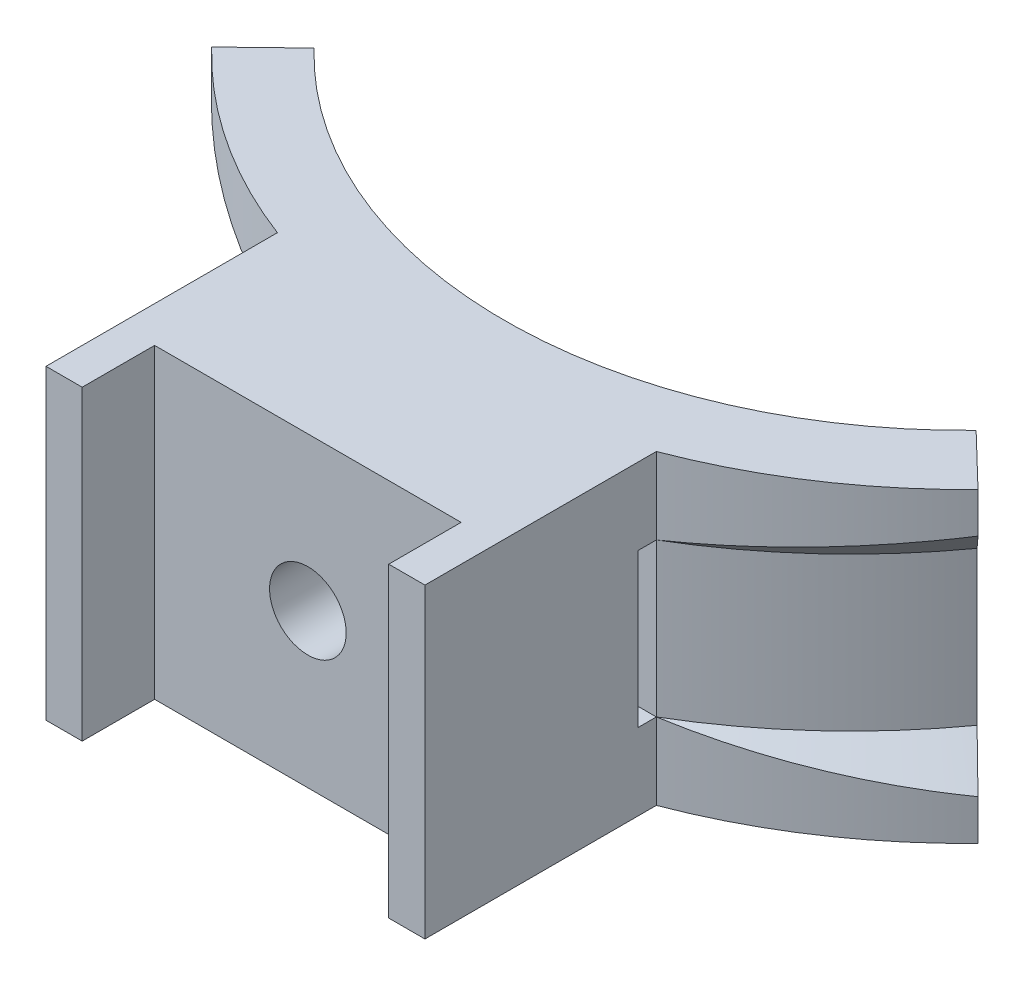
ISO-10303-21;
HEADER;
FILE_DESCRIPTION(('STEP AP214'),'2;1');
FILE_NAME('part.step','',(''),(''),'','','');
FILE_SCHEMA(('AUTOMOTIVE_DESIGN { 1 0 10303 214 1 1 1 1 }'));
ENDSEC;
DATA;
#1=APPLICATION_CONTEXT('core data for automotive mechanical design processes');
#2=APPLICATION_PROTOCOL_DEFINITION('international standard','automotive_design',2000,#1);
#3=PRODUCT_CONTEXT('',#1,'mechanical');
#4=PRODUCT('Part','Part','',(#3));
#5=PRODUCT_RELATED_PRODUCT_CATEGORY('part','',(#4));
#6=PRODUCT_DEFINITION_FORMATION('','',#4);
#7=PRODUCT_DEFINITION_CONTEXT('part definition',#1,'design');
#8=PRODUCT_DEFINITION('design','',#6,#7);
#9=PRODUCT_DEFINITION_SHAPE('','',#8);
#10=(LENGTH_UNIT() NAMED_UNIT(*) SI_UNIT(.MILLI.,.METRE.));
#11=(NAMED_UNIT(*) PLANE_ANGLE_UNIT() SI_UNIT($,.RADIAN.));
#12=(NAMED_UNIT(*) SI_UNIT($,.STERADIAN.) SOLID_ANGLE_UNIT());
#13=UNCERTAINTY_MEASURE_WITH_UNIT(LENGTH_MEASURE(1.E-05),#10,'distance_accuracy_value','');
#14=(GEOMETRIC_REPRESENTATION_CONTEXT(3) GLOBAL_UNCERTAINTY_ASSIGNED_CONTEXT((#13)) GLOBAL_UNIT_ASSIGNED_CONTEXT((#10,
#11,#12)) REPRESENTATION_CONTEXT('',''));
#15=CARTESIAN_POINT('',(0.,0.,0.));
#16=DIRECTION('',(0.,0.,1.));
#17=DIRECTION('',(1.,0.,0.));
#18=AXIS2_PLACEMENT_3D('',#15,#16,#17);
#19=CARTESIAN_POINT('',(0.,25.4,0.));
#20=DIRECTION('',(0.,-1.,0.));
#21=DIRECTION('',(0.,0.,-1.));
#22=AXIS2_PLACEMENT_3D('',#19,#20,#21);
#23=CYLINDRICAL_SURFACE('',#22,44.1);
#24=CARTESIAN_POINT('',(-15.7,19.05,41.2106782278574));
#25=CARTESIAN_POINT('',(-16.1794318143844,19.1377452047471,41.0280290347982));
#26=CARTESIAN_POINT('',(-16.6557143404373,19.2250043785236,40.8369988944627));
#27=CARTESIAN_POINT('',(-17.6014853007342,19.398478543785,40.4383619029228));
#28=CARTESIAN_POINT('',(-18.0709737171541,19.4846935325305,40.230755008239));
#29=CARTESIAN_POINT('',(-19.46836332792,19.741638080068,39.5834121464063));
#30=CARTESIAN_POINT('',(-20.3853306341585,19.9106931522492,39.1191000000862));
#31=CARTESIAN_POINT('',(-22.1852458721086,20.2436078493372,38.1271686212862));
#32=CARTESIAN_POINT('',(-23.0681937123725,20.4074674602779,37.5995492186456));
#33=CARTESIAN_POINT('',(-24.7958080114586,20.7293807747171,36.483359329689));
#34=CARTESIAN_POINT('',(-25.6404743588203,20.8874344613108,35.8947886659234));
#35=CARTESIAN_POINT('',(-27.2873534500066,21.1971476330918,34.6593397989529));
#36=CARTESIAN_POINT('',(-28.0895660628164,21.3488070985459,34.0124614158234));
#37=CARTESIAN_POINT('',(-29.3685424485167,21.5921031279074,32.9049620087819));
#38=CARTESIAN_POINT('',(-29.859031796271,21.6857963947918,32.4605343667437));
#39=CARTESIAN_POINT('',(-30.8198732270883,21.8701830885772,31.5497029800591));
#40=CARTESIAN_POINT('',(-31.2902227045263,21.9608761269762,31.0832964081549));
#41=CARTESIAN_POINT('',(-31.75,22.0499999999999,30.6063310444098));
#42=B_SPLINE_CURVE_WITH_KNOTS('',3,(#24,#25,#26,#27,#28,#29,#30,#31,#32,#33,#34,#35,#36,#37,#38,
#39,#40,#41),.UNSPECIFIED.,.F.,.F.,(4,2,2,2,2,2,2,2,4),(0.,1.56132329162508,3.12265067860206,
6.24484478020459,9.36704727399547,12.4892588578211,15.6114800764251,17.6163183400962,
19.6214152037198),.UNSPECIFIED.);
#43=CARTESIAN_POINT('',(-15.7,19.05,41.2106782278574));
#44=VERTEX_POINT('',#43);
#45=CARTESIAN_POINT('',(-31.75,22.0499999999999,30.6063310444098));
#46=VERTEX_POINT('',#45);
#47=EDGE_CURVE('E203',#44,#46,#42,.T.);
#48=ORIENTED_EDGE('',*,*,#47,.F.);
#49=DIRECTION('',(0.,-1.,0.));
#50=VECTOR('',#49,1.);
#51=CARTESIAN_POINT('',(-15.7,25.4,41.2106782278574));
#52=LINE('',#51,#50);
#53=CARTESIAN_POINT('',(-15.7,25.4,41.2106782278574));
#54=VERTEX_POINT('',#53);
#55=EDGE_CURVE('E268',#54,#44,#52,.T.);
#56=ORIENTED_EDGE('',*,*,#55,.F.);
#57=CARTESIAN_POINT('',(0.,25.4,0.));
#58=DIRECTION('',(0.,1.,0.));
#59=DIRECTION('',(0.,0.,1.));
#60=AXIS2_PLACEMENT_3D('',#57,#58,#59);
#61=CIRCLE('',#60,44.1);
#62=CARTESIAN_POINT('',(-31.75,25.4,30.6063310444097));
#63=VERTEX_POINT('',#62);
#64=EDGE_CURVE('E227',#63,#54,#61,.T.);
#65=ORIENTED_EDGE('',*,*,#64,.F.);
#66=DIRECTION('',(0.,-1.,0.));
#67=VECTOR('',#66,1.);
#68=CARTESIAN_POINT('',(-31.75,25.4,30.6063310444097));
#69=LINE('',#68,#67);
#70=EDGE_CURVE('E220',#63,#46,#69,.T.);
#71=ORIENTED_EDGE('',*,*,#70,.T.);
#72=EDGE_LOOP('',(#48,#56,#65,#71));
#73=FACE_BOUND('',#72,.T.);
#74=ADVANCED_FACE('F32',(#73),#23,.T.);
#75=CARTESIAN_POINT('',(-27.4302721088435,25.4,26.4422043717009));
#76=DIRECTION('',(0.694021112118135,0.,0.719954648526077));
#77=DIRECTION('',(0.719954648526077,0.,-0.694021112118135));
#78=AXIS2_PLACEMENT_3D('',#75,#76,#77);
#79=PLANE('',#78);
#80=DIRECTION('',(-0.509084814119573,0.707106781186538,0.49074703466537));
#81=VECTOR('',#80,1.);
#82=CARTESIAN_POINT('',(-29.5901360544218,19.05,28.5242677080554));
#83=LINE('',#82,#81);
#84=CARTESIAN_POINT('',(-29.5901360544218,19.05,28.5242677080553));
#85=VERTEX_POINT('',#84);
#86=EDGE_CURVE('E206',#85,#46,#83,.T.);
#87=ORIENTED_EDGE('',*,*,#86,.T.);
#88=ORIENTED_EDGE('',*,*,#70,.F.);
#89=DIRECTION('',(-0.719954648526077,0.,0.694021112118135));
#90=VECTOR('',#89,1.);
#91=CARTESIAN_POINT('',(-27.4302721088435,25.4,26.4422043717009));
#92=LINE('',#91,#90);
#93=CARTESIAN_POINT('',(-27.4302721088435,25.4,26.4422043717009));
#94=VERTEX_POINT('',#93);
#95=EDGE_CURVE('E234',#94,#63,#92,.T.);
#96=ORIENTED_EDGE('',*,*,#95,.F.);
#97=DIRECTION('',(0.,-1.,0.));
#98=VECTOR('',#97,1.);
#99=CARTESIAN_POINT('',(-27.4302721088435,25.4,26.4422043717009));
#100=LINE('',#99,#98);
#101=CARTESIAN_POINT('',(-27.4302721088435,0.,26.4422043717009));
#102=VERTEX_POINT('',#101);
#103=EDGE_CURVE('E228',#94,#102,#100,.T.);
#104=ORIENTED_EDGE('',*,*,#103,.T.);
#105=DIRECTION('',(-0.719954648526077,0.,0.694021112118135));
#106=VECTOR('',#105,1.);
#107=CARTESIAN_POINT('',(-27.4302721088435,0.,26.4422043717009));
#108=LINE('',#107,#106);
#109=CARTESIAN_POINT('',(-31.75,0.,30.6063310444097));
#110=VERTEX_POINT('',#109);
#111=EDGE_CURVE('E236',#102,#110,#108,.T.);
#112=ORIENTED_EDGE('',*,*,#111,.T.);
#113=CARTESIAN_POINT('',(-31.75,3.35000000000008,30.6063310444098));
#114=VERTEX_POINT('',#113);
#115=EDGE_CURVE('E229',#114,#110,#69,.T.);
#116=ORIENTED_EDGE('',*,*,#115,.F.);
#117=DIRECTION('',(-0.509084814119573,-0.707106781186538,0.49074703466537));
#118=VECTOR('',#117,1.);
#119=CARTESIAN_POINT('',(-29.5901360544218,6.35,28.5242677080554));
#120=LINE('',#119,#118);
#121=CARTESIAN_POINT('',(-29.5901360544218,6.35,28.5242677080554));
#122=VERTEX_POINT('',#121);
#123=EDGE_CURVE('E213',#122,#114,#120,.T.);
#124=ORIENTED_EDGE('',*,*,#123,.F.);
#125=DIRECTION('',(0.,-1.,0.));
#126=VECTOR('',#125,1.);
#127=CARTESIAN_POINT('',(-29.5901360544218,39.5084337591357,28.5242677080553));
#128=LINE('',#127,#126);
#129=EDGE_CURVE('E224',#85,#122,#128,.T.);
#130=ORIENTED_EDGE('',*,*,#129,.F.);
#131=EDGE_LOOP('',(#87,#88,#96,#104,#112,#116,#124,#130));
#132=FACE_BOUND('',#131,.T.);
#133=ADVANCED_FACE('F218',(#132),#79,.F.);
#134=CARTESIAN_POINT('',(0.,25.4,0.));
#135=DIRECTION('',(0.,-1.,0.));
#136=DIRECTION('',(0.,0.,-1.));
#137=AXIS2_PLACEMENT_3D('',#134,#135,#136);
#138=CYLINDRICAL_SURFACE('',#137,44.1);
#139=CARTESIAN_POINT('',(15.7,6.34999999999997,41.2106782278574));
#140=CARTESIAN_POINT('',(16.1794318143844,6.2622547952529,41.0280290347982));
#141=CARTESIAN_POINT('',(16.6557143404373,6.17499562147643,40.8369988944627));
#142=CARTESIAN_POINT('',(17.6014853007342,6.00152145621501,40.4383619029227));
#143=CARTESIAN_POINT('',(18.0709737171541,5.91530646746954,40.230755008239));
#144=CARTESIAN_POINT('',(19.46836332792,5.65836191993195,39.5834121464062));
#145=CARTESIAN_POINT('',(20.3853306341585,5.4893068477508,39.1191000000862));
#146=CARTESIAN_POINT('',(22.1852458721086,5.15639215066279,38.1271686212862));
#147=CARTESIAN_POINT('',(23.0681937123725,4.99253253972206,37.5995492186456));
#148=CARTESIAN_POINT('',(24.7958080114586,4.67061922528286,36.483359329689));
#149=CARTESIAN_POINT('',(25.6404743588203,4.51256553868918,35.8947886659235));
#150=CARTESIAN_POINT('',(27.2873534500066,4.20285236690818,34.6593397989529));
#151=CARTESIAN_POINT('',(28.0895660628164,4.05119290145411,34.0124614158234));
#152=CARTESIAN_POINT('',(29.3685424485167,3.80789687209262,32.9049620087819));
#153=CARTESIAN_POINT('',(29.859031796271,3.71420360520819,32.4605343667437));
#154=CARTESIAN_POINT('',(30.8198732270883,3.52981691142275,31.5497029800591));
#155=CARTESIAN_POINT('',(31.2902227045263,3.43912387302378,31.0832964081549));
#156=CARTESIAN_POINT('',(31.75,3.35000000000008,30.6063310444098));
#157=B_SPLINE_CURVE_WITH_KNOTS('',3,(#139,#140,#141,#142,#143,#144,#145,#146,#147,#148,#149,
#150,#151,#152,#153,#154,#155,#156),.UNSPECIFIED.,.F.,.F.,(4,2,2,2,2,2,2,2,4),(0.,
1.56132329162508,3.12265067860206,6.24484478020458,9.36704727399547,12.4892588578211,
15.6114800764251,17.6163183400962,19.6214152037198),.UNSPECIFIED.);
#158=CARTESIAN_POINT('',(15.7,6.34999999999996,41.2106782278574));
#159=VERTEX_POINT('',#158);
#160=CARTESIAN_POINT('',(31.75,3.35000000000008,30.6063310444098));
#161=VERTEX_POINT('',#160);
#162=EDGE_CURVE('E450',#159,#161,#157,.T.);
#163=ORIENTED_EDGE('',*,*,#162,.F.);
#164=DIRECTION('',(0.,-1.,0.));
#165=VECTOR('',#164,1.);
#166=CARTESIAN_POINT('',(15.7,25.4,41.2106782278574));
#167=LINE('',#166,#165);
#168=CARTESIAN_POINT('',(15.7,0.,41.2106782278574));
#169=VERTEX_POINT('',#168);
#170=EDGE_CURVE('E245',#159,#169,#167,.T.);
#171=ORIENTED_EDGE('',*,*,#170,.T.);
#172=CARTESIAN_POINT('',(0.,0.,0.));
#173=DIRECTION('',(0.,1.,0.));
#174=DIRECTION('',(0.,0.,1.));
#175=AXIS2_PLACEMENT_3D('',#172,#173,#174);
#176=CIRCLE('',#175,44.1);
#177=CARTESIAN_POINT('',(31.75,0.,30.6063310444097));
#178=VERTEX_POINT('',#177);
#179=EDGE_CURVE('E425',#169,#178,#176,.T.);
#180=ORIENTED_EDGE('',*,*,#179,.T.);
#181=DIRECTION('',(0.,-1.,0.));
#182=VECTOR('',#181,1.);
#183=CARTESIAN_POINT('',(31.75,25.4,30.6063310444097));
#184=LINE('',#183,#182);
#185=EDGE_CURVE('E241',#161,#178,#184,.T.);
#186=ORIENTED_EDGE('',*,*,#185,.F.);
#187=EDGE_LOOP('',(#163,#171,#180,#186));
#188=FACE_BOUND('',#187,.T.);
#189=ADVANCED_FACE('F489',(#188),#138,.T.);
#190=CARTESIAN_POINT('',(27.4302721088435,25.4,26.4422043717009));
#191=DIRECTION('',(-0.694021112118135,0.,0.719954648526077));
#192=DIRECTION('',(0.719954648526077,0.,0.694021112118135));
#193=AXIS2_PLACEMENT_3D('',#190,#191,#192);
#194=PLANE('',#193);
#195=DIRECTION('',(0.509084814119573,-0.707106781186538,0.49074703466537));
#196=VECTOR('',#195,1.);
#197=CARTESIAN_POINT('',(29.5901360544218,6.35,28.5242677080554));
#198=LINE('',#197,#196);
#199=CARTESIAN_POINT('',(29.5901360544218,6.34999999999995,28.5242677080553));
#200=VERTEX_POINT('',#199);
#201=EDGE_CURVE('E447',#200,#161,#198,.T.);
#202=ORIENTED_EDGE('',*,*,#201,.T.);
#203=ORIENTED_EDGE('',*,*,#185,.T.);
#204=DIRECTION('',(-0.719954648526077,0.,-0.694021112118135));
#205=VECTOR('',#204,1.);
#206=CARTESIAN_POINT('',(27.4302721088435,0.,26.4422043717009));
#207=LINE('',#206,#205);
#208=CARTESIAN_POINT('',(27.4302721088435,0.,26.4422043717009));
#209=VERTEX_POINT('',#208);
#210=EDGE_CURVE('E428',#178,#209,#207,.T.);
#211=ORIENTED_EDGE('',*,*,#210,.T.);
#212=DIRECTION('',(0.,-1.,0.));
#213=VECTOR('',#212,1.);
#214=CARTESIAN_POINT('',(27.4302721088435,25.4,26.4422043717009));
#215=LINE('',#214,#213);
#216=CARTESIAN_POINT('',(27.4302721088435,25.4,26.4422043717009));
#217=VERTEX_POINT('',#216);
#218=EDGE_CURVE('E232',#217,#209,#215,.T.);
#219=ORIENTED_EDGE('',*,*,#218,.F.);
#220=DIRECTION('',(-0.719954648526077,0.,-0.694021112118135));
#221=VECTOR('',#220,1.);
#222=CARTESIAN_POINT('',(27.4302721088435,25.4,26.4422043717009));
#223=LINE('',#222,#221);
#224=CARTESIAN_POINT('',(31.75,25.4,30.6063310444097));
#225=VERTEX_POINT('',#224);
#226=EDGE_CURVE('E403',#225,#217,#223,.T.);
#227=ORIENTED_EDGE('',*,*,#226,.F.);
#228=CARTESIAN_POINT('',(31.75,22.0499999999999,30.6063310444098));
#229=VERTEX_POINT('',#228);
#230=EDGE_CURVE('E242',#225,#229,#184,.T.);
#231=ORIENTED_EDGE('',*,*,#230,.T.);
#232=DIRECTION('',(0.509084814119573,0.707106781186538,0.49074703466537));
#233=VECTOR('',#232,1.);
#234=CARTESIAN_POINT('',(29.5901360544218,19.05,28.5242677080554));
#235=LINE('',#234,#233);
#236=CARTESIAN_POINT('',(29.5901360544218,19.05,28.5242677080554));
#237=VERTEX_POINT('',#236);
#238=EDGE_CURVE('E480',#237,#229,#235,.T.);
#239=ORIENTED_EDGE('',*,*,#238,.F.);
#240=DIRECTION('',(0.,-1.,0.));
#241=VECTOR('',#240,1.);
#242=CARTESIAN_POINT('',(29.5901360544218,39.5084337591357,28.5242677080553));
#243=LINE('',#242,#241);
#244=EDGE_CURVE('E343',#237,#200,#243,.T.);
#245=ORIENTED_EDGE('',*,*,#244,.T.);
#246=EDGE_LOOP('',(#202,#203,#211,#219,#227,#231,#239,#245));
#247=FACE_BOUND('',#246,.T.);
#248=ADVANCED_FACE('F490',(#247),#194,.F.);
#249=CARTESIAN_POINT('',(-15.7,6.35,41.2106782278574));
#250=VERTEX_POINT('',#249);
#251=CARTESIAN_POINT('',(-15.7,0.,41.2106782278574));
#252=VERTEX_POINT('',#251);
#253=EDGE_CURVE('E267',#250,#252,#52,.T.);
#254=ORIENTED_EDGE('',*,*,#253,.F.);
#255=CARTESIAN_POINT('',(-15.7,6.34999999999995,41.2106782278574));
#256=CARTESIAN_POINT('',(-16.1794318143844,6.26225479525288,41.0280290347982));
#257=CARTESIAN_POINT('',(-16.6557143404373,6.17499562147642,40.8369988944627));
#258=CARTESIAN_POINT('',(-17.6014853007342,6.001521456215,40.4383619029228));
#259=CARTESIAN_POINT('',(-18.070973717154,5.91530646746954,40.230755008239));
#260=CARTESIAN_POINT('',(-19.46836332792,5.65836191993195,39.5834121464063));
#261=CARTESIAN_POINT('',(-20.3853306341585,5.4893068477508,39.1191000000862));
#262=CARTESIAN_POINT('',(-22.1852458721086,5.15639215066278,38.1271686212862));
#263=CARTESIAN_POINT('',(-23.0681937123725,4.99253253972206,37.5995492186456));
#264=CARTESIAN_POINT('',(-24.7958080114586,4.67061922528285,36.483359329689));
#265=CARTESIAN_POINT('',(-25.6404743588203,4.51256553868917,35.8947886659235));
#266=CARTESIAN_POINT('',(-27.2873534500066,4.20285236690818,34.6593397989529));
#267=CARTESIAN_POINT('',(-28.0895660628164,4.05119290145411,34.0124614158233));
#268=CARTESIAN_POINT('',(-29.3685424485167,3.80789687209262,32.9049620087819));
#269=CARTESIAN_POINT('',(-29.859031796271,3.71420360520818,32.4605343667437));
#270=CARTESIAN_POINT('',(-30.8198732270883,3.52981691142274,31.5497029800591));
#271=CARTESIAN_POINT('',(-31.2902227045263,3.43912387302377,31.0832964081549));
#272=CARTESIAN_POINT('',(-31.75,3.35000000000008,30.6063310444098));
#273=B_SPLINE_CURVE_WITH_KNOTS('',3,(#255,#256,#257,#258,#259,#260,#261,#262,#263,#264,#265,
#266,#267,#268,#269,#270,#271,#272),.UNSPECIFIED.,.F.,.F.,(4,2,2,2,2,2,2,2,4),(0.,
1.56132329162508,3.12265067860205,6.24484478020458,9.36704727399548,12.4892588578211,
15.6114800764251,17.6163183400962,19.6214152037198),.UNSPECIFIED.);
#274=EDGE_CURVE('E445',#250,#114,#273,.T.);
#275=ORIENTED_EDGE('',*,*,#274,.T.);
#276=ORIENTED_EDGE('',*,*,#115,.T.);
#277=CARTESIAN_POINT('',(0.,0.,0.));
#278=DIRECTION('',(0.,1.,0.));
#279=DIRECTION('',(0.,0.,1.));
#280=AXIS2_PLACEMENT_3D('',#277,#278,#279);
#281=CIRCLE('',#280,44.1);
#282=EDGE_CURVE('E385',#110,#252,#281,.T.);
#283=ORIENTED_EDGE('',*,*,#282,.T.);
#284=EDGE_LOOP('',(#254,#275,#276,#283));
#285=FACE_BOUND('',#284,.T.);
#286=ADVANCED_FACE('F443',(#285),#23,.T.);
#287=CARTESIAN_POINT('',(-15.7,25.4,41.2106782278574));
#288=DIRECTION('',(1.,0.,0.));
#289=DIRECTION('',(0.,0.,-1.));
#290=AXIS2_PLACEMENT_3D('',#287,#288,#289);
#291=PLANE('',#290);
#292=ORIENTED_EDGE('',*,*,#55,.T.);
#293=DIRECTION('',(0.,0.,1.));
#294=VECTOR('',#293,1.);
#295=CARTESIAN_POINT('',(-15.7,19.05,41.2106782278574));
#296=LINE('',#295,#294);
#297=CARTESIAN_POINT('',(-15.7,19.05,42.7106782278574));
#298=VERTEX_POINT('',#297);
#299=EDGE_CURVE('E376',#44,#298,#296,.T.);
#300=ORIENTED_EDGE('',*,*,#299,.T.);
#301=DIRECTION('',(0.,-1.,0.));
#302=VECTOR('',#301,1.);
#303=CARTESIAN_POINT('',(-15.7,25.4,42.7106782278574));
#304=LINE('',#303,#302);
#305=CARTESIAN_POINT('',(-15.7,6.35,42.7106782278574));
#306=VERTEX_POINT('',#305);
#307=EDGE_CURVE('E379',#298,#306,#304,.T.);
#308=ORIENTED_EDGE('',*,*,#307,.T.);
#309=DIRECTION('',(0.,0.,-1.));
#310=VECTOR('',#309,1.);
#311=CARTESIAN_POINT('',(-15.7,6.35,41.2106782278574));
#312=LINE('',#311,#310);
#313=EDGE_CURVE('E382',#306,#250,#312,.T.);
#314=ORIENTED_EDGE('',*,*,#313,.T.);
#315=ORIENTED_EDGE('',*,*,#253,.T.);
#316=DIRECTION('',(0.,0.,1.));
#317=VECTOR('',#316,1.);
#318=CARTESIAN_POINT('',(-15.7,0.,41.2106782278574));
#319=LINE('',#318,#317);
#320=CARTESIAN_POINT('',(-15.7,0.,60.385));
#321=VERTEX_POINT('',#320);
#322=EDGE_CURVE('E410',#252,#321,#319,.T.);
#323=ORIENTED_EDGE('',*,*,#322,.T.);
#324=DIRECTION('',(0.,-1.,0.));
#325=VECTOR('',#324,1.);
#326=CARTESIAN_POINT('',(-15.7,25.4,60.385));
#327=LINE('',#326,#325);
#328=CARTESIAN_POINT('',(-15.7,25.4,60.385));
#329=VERTEX_POINT('',#328);
#330=EDGE_CURVE('E264',#329,#321,#327,.T.);
#331=ORIENTED_EDGE('',*,*,#330,.F.);
#332=DIRECTION('',(0.,0.,1.));
#333=VECTOR('',#332,1.);
#334=CARTESIAN_POINT('',(-15.7,25.4,41.2106782278574));
#335=LINE('',#334,#333);
#336=EDGE_CURVE('E387',#54,#329,#335,.T.);
#337=ORIENTED_EDGE('',*,*,#336,.F.);
#338=EDGE_LOOP('',(#292,#300,#308,#314,#315,#323,#331,#337));
#339=FACE_BOUND('',#338,.T.);
#340=ADVANCED_FACE('F514',(#339),#291,.F.);
#341=CARTESIAN_POINT('',(-15.7,25.4,60.385));
#342=DIRECTION('',(0.,0.,-1.));
#343=DIRECTION('',(-1.,0.,0.));
#344=AXIS2_PLACEMENT_3D('',#341,#342,#343);
#345=PLANE('',#344);
#346=DIRECTION('',(1.,0.,0.));
#347=VECTOR('',#346,1.);
#348=CARTESIAN_POINT('',(-15.7,0.,60.385));
#349=LINE('',#348,#347);
#350=CARTESIAN_POINT('',(-12.7,0.,60.385));
#351=VERTEX_POINT('',#350);
#352=EDGE_CURVE('E412',#321,#351,#349,.T.);
#353=ORIENTED_EDGE('',*,*,#352,.T.);
#354=DIRECTION('',(0.,-1.,0.));
#355=VECTOR('',#354,1.);
#356=CARTESIAN_POINT('',(-12.7,25.4,60.385));
#357=LINE('',#356,#355);
#358=CARTESIAN_POINT('',(-12.7,25.4,60.385));
#359=VERTEX_POINT('',#358);
#360=EDGE_CURVE('E261',#359,#351,#357,.T.);
#361=ORIENTED_EDGE('',*,*,#360,.F.);
#362=DIRECTION('',(1.,0.,0.));
#363=VECTOR('',#362,1.);
#364=CARTESIAN_POINT('',(-15.7,25.4,60.385));
#365=LINE('',#364,#363);
#366=EDGE_CURVE('E389',#329,#359,#365,.T.);
#367=ORIENTED_EDGE('',*,*,#366,.F.);
#368=ORIENTED_EDGE('',*,*,#330,.T.);
#369=EDGE_LOOP('',(#353,#361,#367,#368));
#370=FACE_BOUND('',#369,.T.);
#371=ADVANCED_FACE('F511',(#370),#345,.F.);
#372=CARTESIAN_POINT('',(-12.7,25.4,54.385));
#373=DIRECTION('',(-1.,0.,0.));
#374=DIRECTION('',(0.,0.,1.));
#375=AXIS2_PLACEMENT_3D('',#372,#373,#374);
#376=PLANE('',#375);
#377=DIRECTION('',(0.,0.,-1.));
#378=VECTOR('',#377,1.);
#379=CARTESIAN_POINT('',(-12.7,0.,54.385));
#380=LINE('',#379,#378);
#381=CARTESIAN_POINT('',(-12.7,0.,54.385));
#382=VERTEX_POINT('',#381);
#383=EDGE_CURVE('E414',#351,#382,#380,.T.);
#384=ORIENTED_EDGE('',*,*,#383,.T.);
#385=DIRECTION('',(0.,-1.,0.));
#386=VECTOR('',#385,1.);
#387=CARTESIAN_POINT('',(-12.7,25.4,54.385));
#388=LINE('',#387,#386);
#389=CARTESIAN_POINT('',(-12.7,25.4,54.385));
#390=VERTEX_POINT('',#389);
#391=EDGE_CURVE('E258',#390,#382,#388,.T.);
#392=ORIENTED_EDGE('',*,*,#391,.F.);
#393=DIRECTION('',(0.,0.,-1.));
#394=VECTOR('',#393,1.);
#395=CARTESIAN_POINT('',(-12.7,25.4,54.385));
#396=LINE('',#395,#394);
#397=EDGE_CURVE('E391',#359,#390,#396,.T.);
#398=ORIENTED_EDGE('',*,*,#397,.F.);
#399=ORIENTED_EDGE('',*,*,#360,.T.);
#400=EDGE_LOOP('',(#384,#392,#398,#399));
#401=FACE_BOUND('',#400,.T.);
#402=ADVANCED_FACE('F507',(#401),#376,.F.);
#403=CARTESIAN_POINT('',(-12.7,25.4,54.385));
#404=DIRECTION('',(0.,0.,-1.));
#405=DIRECTION('',(-1.,0.,0.));
#406=AXIS2_PLACEMENT_3D('',#403,#404,#405);
#407=PLANE('',#406);
#408=CARTESIAN_POINT('',(0.,12.7,54.385));
#409=DIRECTION('',(0.,0.,1.));
#410=DIRECTION('',(1.,0.,0.));
#411=AXIS2_PLACEMENT_3D('',#408,#409,#410);
#412=CIRCLE('',#411,3.175);
#413=CARTESIAN_POINT('',(3.175,12.7,54.385));
#414=VERTEX_POINT('',#413);
#415=EDGE_CURVE('E333',#414,#414,#412,.T.);
#416=ORIENTED_EDGE('',*,*,#415,.F.);
#417=EDGE_LOOP('',(#416));
#418=FACE_BOUND('',#417,.T.);
#419=DIRECTION('',(1.,0.,0.));
#420=VECTOR('',#419,1.);
#421=CARTESIAN_POINT('',(-12.7,0.,54.385));
#422=LINE('',#421,#420);
#423=CARTESIAN_POINT('',(12.7,0.,54.385));
#424=VERTEX_POINT('',#423);
#425=EDGE_CURVE('E416',#382,#424,#422,.T.);
#426=ORIENTED_EDGE('',*,*,#425,.T.);
#427=DIRECTION('',(0.,-1.,0.));
#428=VECTOR('',#427,1.);
#429=CARTESIAN_POINT('',(12.7,25.4,54.385));
#430=LINE('',#429,#428);
#431=CARTESIAN_POINT('',(12.7,25.4,54.385));
#432=VERTEX_POINT('',#431);
#433=EDGE_CURVE('E255',#432,#424,#430,.T.);
#434=ORIENTED_EDGE('',*,*,#433,.F.);
#435=DIRECTION('',(1.,0.,0.));
#436=VECTOR('',#435,1.);
#437=CARTESIAN_POINT('',(-12.7,25.4,54.385));
#438=LINE('',#437,#436);
#439=EDGE_CURVE('E393',#390,#432,#438,.T.);
#440=ORIENTED_EDGE('',*,*,#439,.F.);
#441=ORIENTED_EDGE('',*,*,#391,.T.);
#442=EDGE_LOOP('',(#426,#434,#440,#441));
#443=FACE_BOUND('',#442,.T.);
#444=ADVANCED_FACE('F503',(#418,#443),#407,.F.);
#445=CARTESIAN_POINT('',(12.7,25.4,54.385));
#446=DIRECTION('',(1.,0.,0.));
#447=DIRECTION('',(0.,0.,-1.));
#448=AXIS2_PLACEMENT_3D('',#445,#446,#447);
#449=PLANE('',#448);
#450=DIRECTION('',(0.,0.,1.));
#451=VECTOR('',#450,1.);
#452=CARTESIAN_POINT('',(12.7,0.,54.385));
#453=LINE('',#452,#451);
#454=CARTESIAN_POINT('',(12.7,0.,60.385));
#455=VERTEX_POINT('',#454);
#456=EDGE_CURVE('E418',#424,#455,#453,.T.);
#457=ORIENTED_EDGE('',*,*,#456,.T.);
#458=DIRECTION('',(0.,-1.,0.));
#459=VECTOR('',#458,1.);
#460=CARTESIAN_POINT('',(12.7,25.4,60.385));
#461=LINE('',#460,#459);
#462=CARTESIAN_POINT('',(12.7,25.4,60.385));
#463=VERTEX_POINT('',#462);
#464=EDGE_CURVE('E252',#463,#455,#461,.T.);
#465=ORIENTED_EDGE('',*,*,#464,.F.);
#466=DIRECTION('',(0.,0.,1.));
#467=VECTOR('',#466,1.);
#468=CARTESIAN_POINT('',(12.7,25.4,54.385));
#469=LINE('',#468,#467);
#470=EDGE_CURVE('E395',#432,#463,#469,.T.);
#471=ORIENTED_EDGE('',*,*,#470,.F.);
#472=ORIENTED_EDGE('',*,*,#433,.T.);
#473=EDGE_LOOP('',(#457,#465,#471,#472));
#474=FACE_BOUND('',#473,.T.);
#475=ADVANCED_FACE('F499',(#474),#449,.F.);
#476=CARTESIAN_POINT('',(15.7,25.4,60.385));
#477=DIRECTION('',(0.,0.,-1.));
#478=DIRECTION('',(-1.,0.,0.));
#479=AXIS2_PLACEMENT_3D('',#476,#477,#478);
#480=PLANE('',#479);
#481=DIRECTION('',(1.,0.,0.));
#482=VECTOR('',#481,1.);
#483=CARTESIAN_POINT('',(15.7,0.,60.385));
#484=LINE('',#483,#482);
#485=CARTESIAN_POINT('',(15.7,0.,60.385));
#486=VERTEX_POINT('',#485);
#487=EDGE_CURVE('E420',#455,#486,#484,.T.);
#488=ORIENTED_EDGE('',*,*,#487,.T.);
#489=DIRECTION('',(0.,-1.,0.));
#490=VECTOR('',#489,1.);
#491=CARTESIAN_POINT('',(15.7,25.4,60.385));
#492=LINE('',#491,#490);
#493=CARTESIAN_POINT('',(15.7,25.4,60.385));
#494=VERTEX_POINT('',#493);
#495=EDGE_CURVE('E249',#494,#486,#492,.T.);
#496=ORIENTED_EDGE('',*,*,#495,.F.);
#497=DIRECTION('',(1.,0.,0.));
#498=VECTOR('',#497,1.);
#499=CARTESIAN_POINT('',(15.7,25.4,60.385));
#500=LINE('',#499,#498);
#501=EDGE_CURVE('E397',#463,#494,#500,.T.);
#502=ORIENTED_EDGE('',*,*,#501,.F.);
#503=ORIENTED_EDGE('',*,*,#464,.T.);
#504=EDGE_LOOP('',(#488,#496,#502,#503));
#505=FACE_BOUND('',#504,.T.);
#506=ADVANCED_FACE('F495',(#505),#480,.F.);
#507=CARTESIAN_POINT('',(15.7,25.4,41.2106782278574));
#508=DIRECTION('',(-1.,0.,0.));
#509=DIRECTION('',(0.,0.,1.));
#510=AXIS2_PLACEMENT_3D('',#507,#508,#509);
#511=PLANE('',#510);
#512=ORIENTED_EDGE('',*,*,#170,.F.);
#513=DIRECTION('',(0.,0.,-1.));
#514=VECTOR('',#513,1.);
#515=CARTESIAN_POINT('',(15.7,6.35,41.2106782278574));
#516=LINE('',#515,#514);
#517=CARTESIAN_POINT('',(15.7,6.35,42.7106782278574));
#518=VERTEX_POINT('',#517);
#519=EDGE_CURVE('E361',#518,#159,#516,.T.);
#520=ORIENTED_EDGE('',*,*,#519,.F.);
#521=DIRECTION('',(0.,-1.,0.));
#522=VECTOR('',#521,1.);
#523=CARTESIAN_POINT('',(15.7,19.05,42.7106782278574));
#524=LINE('',#523,#522);
#525=CARTESIAN_POINT('',(15.7,19.05,42.7106782278574));
#526=VERTEX_POINT('',#525);
#527=EDGE_CURVE('E358',#526,#518,#524,.T.);
#528=ORIENTED_EDGE('',*,*,#527,.F.);
#529=DIRECTION('',(0.,0.,1.));
#530=VECTOR('',#529,1.);
#531=CARTESIAN_POINT('',(15.7,19.05,41.2106782278574));
#532=LINE('',#531,#530);
#533=CARTESIAN_POINT('',(15.7,19.05,41.2106782278574));
#534=VERTEX_POINT('',#533);
#535=EDGE_CURVE('E355',#534,#526,#532,.T.);
#536=ORIENTED_EDGE('',*,*,#535,.F.);
#537=CARTESIAN_POINT('',(15.7,25.4,41.2106782278574));
#538=VERTEX_POINT('',#537);
#539=EDGE_CURVE('E246',#538,#534,#167,.T.);
#540=ORIENTED_EDGE('',*,*,#539,.F.);
#541=DIRECTION('',(0.,0.,-1.));
#542=VECTOR('',#541,1.);
#543=CARTESIAN_POINT('',(15.7,25.4,41.2106782278574));
#544=LINE('',#543,#542);
#545=EDGE_CURVE('E399',#494,#538,#544,.T.);
#546=ORIENTED_EDGE('',*,*,#545,.F.);
#547=ORIENTED_EDGE('',*,*,#495,.T.);
#548=DIRECTION('',(0.,0.,-1.));
#549=VECTOR('',#548,1.);
#550=CARTESIAN_POINT('',(15.7,0.,41.2106782278574));
#551=LINE('',#550,#549);
#552=EDGE_CURVE('E422',#486,#169,#551,.T.);
#553=ORIENTED_EDGE('',*,*,#552,.T.);
#554=EDGE_LOOP('',(#512,#520,#528,#536,#540,#546,#547,#553));
#555=FACE_BOUND('',#554,.T.);
#556=ADVANCED_FACE('F487',(#555),#511,.F.);
#557=ORIENTED_EDGE('',*,*,#539,.T.);
#558=CARTESIAN_POINT('',(15.7,19.05,41.2106782278574));
#559=CARTESIAN_POINT('',(16.1794318143844,19.1377452047471,41.0280290347982));
#560=CARTESIAN_POINT('',(16.6557143404373,19.2250043785236,40.8369988944627));
#561=CARTESIAN_POINT('',(17.6014853007342,19.398478543785,40.4383619029228));
#562=CARTESIAN_POINT('',(18.070973717154,19.4846935325305,40.230755008239));
#563=CARTESIAN_POINT('',(19.46836332792,19.741638080068,39.5834121464062));
#564=CARTESIAN_POINT('',(20.3853306341585,19.9106931522492,39.1191000000862));
#565=CARTESIAN_POINT('',(22.1852458721086,20.2436078493372,38.1271686212862));
#566=CARTESIAN_POINT('',(23.0681937123725,20.4074674602779,37.5995492186456));
#567=CARTESIAN_POINT('',(24.7958080114586,20.7293807747171,36.483359329689));
#568=CARTESIAN_POINT('',(25.6404743588203,20.8874344613108,35.8947886659235));
#569=CARTESIAN_POINT('',(27.2873534500066,21.1971476330918,34.659339798953));
#570=CARTESIAN_POINT('',(28.0895660628164,21.3488070985459,34.0124614158234));
#571=CARTESIAN_POINT('',(29.3685424485167,21.5921031279074,32.9049620087819));
#572=CARTESIAN_POINT('',(29.859031796271,21.6857963947918,32.4605343667437));
#573=CARTESIAN_POINT('',(30.8198732270883,21.8701830885773,31.5497029800591));
#574=CARTESIAN_POINT('',(31.2902227045263,21.9608761269762,31.0832964081549));
#575=CARTESIAN_POINT('',(31.75,22.0499999999999,30.6063310444098));
#576=B_SPLINE_CURVE_WITH_KNOTS('',3,(#558,#559,#560,#561,#562,#563,#564,#565,#566,#567,#568,
#569,#570,#571,#572,#573,#574,#575),.UNSPECIFIED.,.F.,.F.,(4,2,2,2,2,2,2,2,4),(0.,
1.56132329162509,3.12265067860206,6.24484478020459,9.36704727399547,12.4892588578211,
15.6114800764251,17.6163183400962,19.6214152037198),.UNSPECIFIED.);
#577=EDGE_CURVE('E307',#534,#229,#576,.T.);
#578=ORIENTED_EDGE('',*,*,#577,.T.);
#579=ORIENTED_EDGE('',*,*,#230,.F.);
#580=CARTESIAN_POINT('',(0.,25.4,0.));
#581=DIRECTION('',(0.,1.,0.));
#582=DIRECTION('',(0.,0.,1.));
#583=AXIS2_PLACEMENT_3D('',#580,#581,#582);
#584=CIRCLE('',#583,44.1);
#585=EDGE_CURVE('E401',#538,#225,#584,.T.);
#586=ORIENTED_EDGE('',*,*,#585,.F.);
#587=EDGE_LOOP('',(#557,#578,#579,#586));
#588=FACE_BOUND('',#587,.T.);
#589=ADVANCED_FACE('F481',(#588),#138,.T.);
#590=CARTESIAN_POINT('',(0.,25.4,0.));
#591=DIRECTION('',(0.,-1.,0.));
#592=DIRECTION('',(0.,0.,-1.));
#593=AXIS2_PLACEMENT_3D('',#590,#591,#592);
#594=CYLINDRICAL_SURFACE('',#593,38.1);
#595=CARTESIAN_POINT('',(0.,7.14375,0.));
#596=DIRECTION('',(0.,-1.,0.));
#597=DIRECTION('',(0.,0.,-1.));
#598=AXIS2_PLACEMENT_3D('',#595,#596,#597);
#599=CIRCLE('',#598,38.1);
#600=CARTESIAN_POINT('',(-3.20790243318486,7.14375,37.9647120623766));
#601=VERTEX_POINT('',#600);
#602=CARTESIAN_POINT('',(3.20790243318485,7.14375,37.9647120623766));
#603=VERTEX_POINT('',#602);
#604=EDGE_CURVE('E330',#601,#603,#599,.F.);
#605=ORIENTED_EDGE('',*,*,#604,.T.);
#606=CARTESIAN_POINT('',(0.,1.58750000000001,0.));
#607=DIRECTION('',(0.866025403784439,-0.5,0.));
#608=DIRECTION('',(-0.5,-0.866025403784439,0.));
#609=AXIS2_PLACEMENT_3D('',#606,#607,#608);
#610=ELLIPSE('',#609,76.2,38.1);
#611=CARTESIAN_POINT('',(6.41580486636971,12.7,37.5559242718997));
#612=VERTEX_POINT('',#611);
#613=EDGE_CURVE('E298',#603,#612,#610,.F.);
#614=ORIENTED_EDGE('',*,*,#613,.T.);
#615=CARTESIAN_POINT('',(0.,23.8125,0.));
#616=DIRECTION('',(0.866025403784439,0.5,0.));
#617=DIRECTION('',(0.5,-0.866025403784439,0.));
#618=AXIS2_PLACEMENT_3D('',#615,#616,#617);
#619=ELLIPSE('',#618,76.2,38.1);
#620=CARTESIAN_POINT('',(3.20790243318486,18.25625,37.9647120623766));
#621=VERTEX_POINT('',#620);
#622=EDGE_CURVE('E299',#612,#621,#619,.F.);
#623=ORIENTED_EDGE('',*,*,#622,.T.);
#624=CARTESIAN_POINT('',(0.,18.25625,0.));
#625=DIRECTION('',(0.,1.,0.));
#626=DIRECTION('',(0.,0.,1.));
#627=AXIS2_PLACEMENT_3D('',#624,#625,#626);
#628=CIRCLE('',#627,38.1);
#629=CARTESIAN_POINT('',(-3.20790243318486,18.25625,37.9647120623766));
#630=VERTEX_POINT('',#629);
#631=EDGE_CURVE('E302',#621,#630,#628,.F.);
#632=ORIENTED_EDGE('',*,*,#631,.T.);
#633=CARTESIAN_POINT('',(0.,23.8125,0.));
#634=DIRECTION('',(-0.866025403784439,0.5,0.));
#635=DIRECTION('',(-0.5,-0.866025403784439,0.));
#636=AXIS2_PLACEMENT_3D('',#633,#634,#635);
#637=ELLIPSE('',#636,76.2,38.1);
#638=CARTESIAN_POINT('',(-6.41580486636972,12.7,37.5559242718997));
#639=VERTEX_POINT('',#638);
#640=EDGE_CURVE('E324',#630,#639,#637,.F.);
#641=ORIENTED_EDGE('',*,*,#640,.T.);
#642=CARTESIAN_POINT('',(0.,1.58749999999999,0.));
#643=DIRECTION('',(-0.866025403784439,-0.5,0.));
#644=DIRECTION('',(0.5,-0.866025403784439,0.));
#645=AXIS2_PLACEMENT_3D('',#642,#643,#644);
#646=ELLIPSE('',#645,76.2,38.1);
#647=EDGE_CURVE('E327',#639,#601,#646,.F.);
#648=ORIENTED_EDGE('',*,*,#647,.T.);
#649=EDGE_LOOP('',(#605,#614,#623,#632,#641,#648));
#650=FACE_BOUND('',#649,.T.);
#651=CARTESIAN_POINT('',(0.,0.,0.));
#652=DIRECTION('',(0.,-1.,0.));
#653=DIRECTION('',(0.,0.,1.));
#654=AXIS2_PLACEMENT_3D('',#651,#652,#653);
#655=CIRCLE('',#654,38.1);
#656=EDGE_CURVE('E429',#209,#102,#655,.T.);
#657=ORIENTED_EDGE('',*,*,#656,.T.);
#658=ORIENTED_EDGE('',*,*,#103,.F.);
#659=CARTESIAN_POINT('',(0.,25.4,0.));
#660=DIRECTION('',(0.,-1.,0.));
#661=DIRECTION('',(0.,0.,1.));
#662=AXIS2_PLACEMENT_3D('',#659,#660,#661);
#663=CIRCLE('',#662,38.1);
#664=EDGE_CURVE('E405',#217,#94,#663,.T.);
#665=ORIENTED_EDGE('',*,*,#664,.F.);
#666=ORIENTED_EDGE('',*,*,#218,.T.);
#667=EDGE_LOOP('',(#657,#658,#665,#666));
#668=FACE_BOUND('',#667,.T.);
#669=ADVANCED_FACE('F486',(#650,#668),#594,.F.);
#670=CARTESIAN_POINT('',(0.,25.4,0.));
#671=DIRECTION('',(0.,1.,0.));
#672=DIRECTION('',(0.,0.,1.));
#673=AXIS2_PLACEMENT_3D('',#670,#671,#672);
#674=PLANE('',#673);
#675=ORIENTED_EDGE('',*,*,#64,.T.);
#676=ORIENTED_EDGE('',*,*,#336,.T.);
#677=ORIENTED_EDGE('',*,*,#366,.T.);
#678=ORIENTED_EDGE('',*,*,#397,.T.);
#679=ORIENTED_EDGE('',*,*,#439,.T.);
#680=ORIENTED_EDGE('',*,*,#470,.T.);
#681=ORIENTED_EDGE('',*,*,#501,.T.);
#682=ORIENTED_EDGE('',*,*,#545,.T.);
#683=ORIENTED_EDGE('',*,*,#585,.T.);
#684=ORIENTED_EDGE('',*,*,#226,.T.);
#685=ORIENTED_EDGE('',*,*,#664,.T.);
#686=ORIENTED_EDGE('',*,*,#95,.T.);
#687=EDGE_LOOP('',(#675,#676,#677,#678,#679,#680,#681,#682,#683,#684,#685,#686));
#688=FACE_BOUND('',#687,.T.);
#689=ADVANCED_FACE('F533',(#688),#674,.T.);
#690=CARTESIAN_POINT('',(0.,0.,0.));
#691=DIRECTION('',(0.,1.,0.));
#692=DIRECTION('',(0.,0.,1.));
#693=AXIS2_PLACEMENT_3D('',#690,#691,#692);
#694=PLANE('',#693);
#695=ORIENTED_EDGE('',*,*,#282,.F.);
#696=ORIENTED_EDGE('',*,*,#111,.F.);
#697=ORIENTED_EDGE('',*,*,#656,.F.);
#698=ORIENTED_EDGE('',*,*,#210,.F.);
#699=ORIENTED_EDGE('',*,*,#179,.F.);
#700=ORIENTED_EDGE('',*,*,#552,.F.);
#701=ORIENTED_EDGE('',*,*,#487,.F.);
#702=ORIENTED_EDGE('',*,*,#456,.F.);
#703=ORIENTED_EDGE('',*,*,#425,.F.);
#704=ORIENTED_EDGE('',*,*,#383,.F.);
#705=ORIENTED_EDGE('',*,*,#352,.F.);
#706=ORIENTED_EDGE('',*,*,#322,.F.);
#707=EDGE_LOOP('',(#695,#696,#697,#698,#699,#700,#701,#702,#703,#704,#705,#706));
#708=FACE_BOUND('',#707,.T.);
#709=ADVANCED_FACE('F439',(#708),#694,.F.);
#710=CARTESIAN_POINT('',(-31.75,6.35,41.2106782278574));
#711=DIRECTION('',(0.,-1.,0.));
#712=DIRECTION('',(0.,0.,-1.));
#713=AXIS2_PLACEMENT_3D('',#710,#711,#712);
#714=PLANE('',#713);
#715=DIRECTION('',(1.,0.,0.));
#716=VECTOR('',#715,1.);
#717=CARTESIAN_POINT('',(-31.75,6.35,42.7106782278574));
#718=LINE('',#717,#716);
#719=EDGE_CURVE('E369',#306,#518,#718,.T.);
#720=ORIENTED_EDGE('',*,*,#719,.T.);
#721=ORIENTED_EDGE('',*,*,#519,.T.);
#722=DIRECTION('',(1.,0.,0.));
#723=VECTOR('',#722,1.);
#724=CARTESIAN_POINT('',(-31.75,6.35,41.2106782278574));
#725=LINE('',#724,#723);
#726=EDGE_CURVE('E365',#250,#159,#725,.T.);
#727=ORIENTED_EDGE('',*,*,#726,.F.);
#728=ORIENTED_EDGE('',*,*,#313,.F.);
#729=EDGE_LOOP('',(#720,#721,#727,#728));
#730=FACE_BOUND('',#729,.T.);
#731=ADVANCED_FACE('F572',(#730),#714,.F.);
#732=CARTESIAN_POINT('',(-31.75,19.05,42.7106782278574));
#733=DIRECTION('',(0.,0.,1.));
#734=DIRECTION('',(1.,0.,0.));
#735=AXIS2_PLACEMENT_3D('',#732,#733,#734);
#736=PLANE('',#735);
#737=CARTESIAN_POINT('',(0.,12.7,42.7106782278574));
#738=DIRECTION('',(0.,0.,1.));
#739=DIRECTION('',(1.,0.,0.));
#740=AXIS2_PLACEMENT_3D('',#737,#738,#739);
#741=CIRCLE('',#740,3.175);
#742=CARTESIAN_POINT('',(3.175,12.7,42.7106782278574));
#743=VERTEX_POINT('',#742);
#744=EDGE_CURVE('E336',#743,#743,#741,.T.);
#745=ORIENTED_EDGE('',*,*,#744,.T.);
#746=EDGE_LOOP('',(#745));
#747=FACE_BOUND('',#746,.T.);
#748=DIRECTION('',(1.,0.,0.));
#749=VECTOR('',#748,1.);
#750=CARTESIAN_POINT('',(-31.75,19.05,42.7106782278574));
#751=LINE('',#750,#749);
#752=EDGE_CURVE('E371',#298,#526,#751,.T.);
#753=ORIENTED_EDGE('',*,*,#752,.T.);
#754=ORIENTED_EDGE('',*,*,#527,.T.);
#755=ORIENTED_EDGE('',*,*,#719,.F.);
#756=ORIENTED_EDGE('',*,*,#307,.F.);
#757=EDGE_LOOP('',(#753,#754,#755,#756));
#758=FACE_BOUND('',#757,.T.);
#759=ADVANCED_FACE('F575',(#747,#758),#736,.F.);
#760=CARTESIAN_POINT('',(-31.75,19.05,41.2106782278574));
#761=DIRECTION('',(0.,1.,0.));
#762=DIRECTION('',(0.,0.,1.));
#763=AXIS2_PLACEMENT_3D('',#760,#761,#762);
#764=PLANE('',#763);
#765=DIRECTION('',(1.,0.,0.));
#766=VECTOR('',#765,1.);
#767=CARTESIAN_POINT('',(-31.75,19.05,41.2106782278574));
#768=LINE('',#767,#766);
#769=EDGE_CURVE('E364',#44,#534,#768,.T.);
#770=ORIENTED_EDGE('',*,*,#769,.T.);
#771=ORIENTED_EDGE('',*,*,#535,.T.);
#772=ORIENTED_EDGE('',*,*,#752,.F.);
#773=ORIENTED_EDGE('',*,*,#299,.F.);
#774=EDGE_LOOP('',(#770,#771,#772,#773));
#775=FACE_BOUND('',#774,.T.);
#776=ADVANCED_FACE('F579',(#775),#764,.F.);
#777=CARTESIAN_POINT('',(-31.75,19.05,41.2106782278574));
#778=DIRECTION('',(0.,0.,-1.));
#779=DIRECTION('',(0.,1.,0.));
#780=AXIS2_PLACEMENT_3D('',#777,#778,#779);
#781=PLANE('',#780);
#782=DIRECTION('',(0.5,-0.866025403784439,0.));
#783=VECTOR('',#782,1.);
#784=CARTESIAN_POINT('',(-5.87527700723829,33.988778285078,41.2106782278574));
#785=LINE('',#784,#783);
#786=CARTESIAN_POINT('',(3.20790243318486,18.25625,41.2106782278574));
#787=VERTEX_POINT('',#786);
#788=CARTESIAN_POINT('',(6.41580486636972,12.7,41.2106782278574));
#789=VERTEX_POINT('',#788);
#790=EDGE_CURVE('E271',#787,#789,#785,.T.);
#791=ORIENTED_EDGE('',*,*,#790,.T.);
#792=DIRECTION('',(-0.5,-0.866025403784439,0.));
#793=VECTOR('',#792,1.);
#794=CARTESIAN_POINT('',(-0.376015693207124,0.936221714922032,41.2106782278574));
#795=LINE('',#794,#793);
#796=CARTESIAN_POINT('',(3.20790243318485,7.14375,41.2106782278574));
#797=VERTEX_POINT('',#796);
#798=EDGE_CURVE('E11',#789,#797,#795,.T.);
#799=ORIENTED_EDGE('',*,*,#798,.T.);
#800=DIRECTION('',(-1.,0.,0.));
#801=VECTOR('',#800,1.);
#802=CARTESIAN_POINT('',(-31.75,7.14375,41.2106782278574));
#803=LINE('',#802,#801);
#804=CARTESIAN_POINT('',(-3.20790243318486,7.14375,41.2106782278574));
#805=VERTEX_POINT('',#804);
#806=EDGE_CURVE('E40',#797,#805,#803,.T.);
#807=ORIENTED_EDGE('',*,*,#806,.T.);
#808=DIRECTION('',(-0.5,0.866025403784439,0.));
#809=VECTOR('',#808,1.);
#810=CARTESIAN_POINT('',(-15.4989843067929,28.432528285078,41.2106782278574));
#811=LINE('',#810,#809);
#812=CARTESIAN_POINT('',(-6.41580486636972,12.7,41.2106782278574));
#813=VERTEX_POINT('',#812);
#814=EDGE_CURVE('E280',#805,#813,#811,.T.);
#815=ORIENTED_EDGE('',*,*,#814,.T.);
#816=DIRECTION('',(0.5,0.866025403784439,0.));
#817=VECTOR('',#816,1.);
#818=CARTESIAN_POINT('',(-9.9997229927617,6.49247171492203,41.2106782278574));
#819=LINE('',#818,#817);
#820=CARTESIAN_POINT('',(-3.20790243318486,18.25625,41.2106782278574));
#821=VERTEX_POINT('',#820);
#822=EDGE_CURVE('E277',#813,#821,#819,.T.);
#823=ORIENTED_EDGE('',*,*,#822,.T.);
#824=DIRECTION('',(1.,0.,0.));
#825=VECTOR('',#824,1.);
#826=CARTESIAN_POINT('',(-31.75,18.25625,41.2106782278574));
#827=LINE('',#826,#825);
#828=EDGE_CURVE('E274',#821,#787,#827,.T.);
#829=ORIENTED_EDGE('',*,*,#828,.T.);
#830=EDGE_LOOP('',(#791,#799,#807,#815,#823,#829));
#831=FACE_BOUND('',#830,.T.);
#832=ORIENTED_EDGE('',*,*,#726,.T.);
#833=DIRECTION('',(0.,1.,0.));
#834=VECTOR('',#833,1.);
#835=CARTESIAN_POINT('',(15.7,19.05,41.2106782278574));
#836=LINE('',#835,#834);
#837=EDGE_CURVE('E350',#159,#534,#836,.T.);
#838=ORIENTED_EDGE('',*,*,#837,.T.);
#839=ORIENTED_EDGE('',*,*,#769,.F.);
#840=DIRECTION('',(0.,1.,0.));
#841=VECTOR('',#840,1.);
#842=CARTESIAN_POINT('',(-15.7,25.4,41.2106782278574));
#843=LINE('',#842,#841);
#844=EDGE_CURVE('E368',#250,#44,#843,.T.);
#845=ORIENTED_EDGE('',*,*,#844,.F.);
#846=EDGE_LOOP('',(#832,#838,#839,#845));
#847=FACE_BOUND('',#846,.T.);
#848=ADVANCED_FACE('F284',(#831,#847),#781,.F.);
#849=CARTESIAN_POINT('',(-7.70625799780717,39.5084337591357,1.63632005346037));
#850=DIRECTION('',(0.,-1.,0.));
#851=DIRECTION('',(0.,0.,-1.));
#852=AXIS2_PLACEMENT_3D('',#849,#850,#851);
#853=CYLINDRICAL_SURFACE('',#852,45.9780680148196);
#854=CARTESIAN_POINT('',(-7.70625799780717,19.0499999999999,1.63632005346037));
#855=DIRECTION('',(0.,1.,0.));
#856=DIRECTION('',(0.,0.,1.));
#857=AXIS2_PLACEMENT_3D('',#854,#855,#856);
#858=CIRCLE('',#857,45.9780680148196);
#859=EDGE_CURVE('E347',#237,#534,#858,.F.);
#860=ORIENTED_EDGE('',*,*,#859,.T.);
#861=ORIENTED_EDGE('',*,*,#837,.F.);
#862=CARTESIAN_POINT('',(-7.70625799780717,6.34999999999995,1.63632005346037));
#863=DIRECTION('',(0.,-1.,0.));
#864=DIRECTION('',(0.,0.,-1.));
#865=AXIS2_PLACEMENT_3D('',#862,#863,#864);
#866=CIRCLE('',#865,45.9780680148196);
#867=EDGE_CURVE('E345',#200,#159,#866,.T.);
#868=ORIENTED_EDGE('',*,*,#867,.F.);
#869=ORIENTED_EDGE('',*,*,#244,.F.);
#870=EDGE_LOOP('',(#860,#861,#868,#869));
#871=FACE_BOUND('',#870,.T.);
#872=ADVANCED_FACE('F567',(#871),#853,.T.);
#873=CARTESIAN_POINT('',(7.70625799780717,39.5084337591357,1.63632005346037));
#874=DIRECTION('',(0.,-1.,0.));
#875=DIRECTION('',(0.,0.,-1.));
#876=AXIS2_PLACEMENT_3D('',#873,#874,#875);
#877=CYLINDRICAL_SURFACE('',#876,45.9780680148196);
#878=ORIENTED_EDGE('',*,*,#129,.T.);
#879=CARTESIAN_POINT('',(7.70625799780717,6.34999999999995,1.63632005346037));
#880=DIRECTION('',(0.,1.,0.));
#881=DIRECTION('',(0.,0.,-1.));
#882=AXIS2_PLACEMENT_3D('',#879,#880,#881);
#883=CIRCLE('',#882,45.9780680148196);
#884=EDGE_CURVE('E339',#122,#250,#883,.T.);
#885=ORIENTED_EDGE('',*,*,#884,.T.);
#886=ORIENTED_EDGE('',*,*,#844,.T.);
#887=CARTESIAN_POINT('',(7.70625799780717,19.0499999999999,1.63632005346037));
#888=DIRECTION('',(0.,1.,0.));
#889=DIRECTION('',(0.,0.,1.));
#890=AXIS2_PLACEMENT_3D('',#887,#888,#889);
#891=CIRCLE('',#890,45.9780680148196);
#892=EDGE_CURVE('E208',#85,#44,#891,.T.);
#893=ORIENTED_EDGE('',*,*,#892,.F.);
#894=EDGE_LOOP('',(#878,#885,#886,#893));
#895=FACE_BOUND('',#894,.T.);
#896=ADVANCED_FACE('F563',(#895),#877,.T.);
#897=CARTESIAN_POINT('',(0.,12.7,26.4422043717009));
#898=DIRECTION('',(0.,0.,1.));
#899=DIRECTION('',(1.,0.,0.));
#900=AXIS2_PLACEMENT_3D('',#897,#898,#899);
#901=CYLINDRICAL_SURFACE('',#900,3.175);
#902=ORIENTED_EDGE('',*,*,#415,.T.);
#903=EDGE_LOOP('',(#902));
#904=FACE_BOUND('',#903,.T.);
#905=ORIENTED_EDGE('',*,*,#744,.F.);
#906=EDGE_LOOP('',(#905));
#907=FACE_BOUND('',#906,.T.);
#908=ADVANCED_FACE('F560',(#904,#907),#901,.F.);
#909=CARTESIAN_POINT('',(3.20790243318485,7.14375,26.4422043717009));
#910=DIRECTION('',(0.866025403784439,-0.5,0.));
#911=DIRECTION('',(0.5,0.866025403784439,0.));
#912=AXIS2_PLACEMENT_3D('',#909,#910,#911);
#913=PLANE('',#912);
#914=DIRECTION('',(0.,0.,1.));
#915=VECTOR('',#914,1.);
#916=CARTESIAN_POINT('',(3.20790243318485,7.14375,26.4422043717009));
#917=LINE('',#916,#915);
#918=EDGE_CURVE('E291',#603,#797,#917,.T.);
#919=ORIENTED_EDGE('',*,*,#918,.T.);
#920=ORIENTED_EDGE('',*,*,#798,.F.);
#921=DIRECTION('',(0.,0.,1.));
#922=VECTOR('',#921,1.);
#923=CARTESIAN_POINT('',(6.41580486636971,12.7,26.4422043717009));
#924=LINE('',#923,#922);
#925=EDGE_CURVE('E52',#612,#789,#924,.T.);
#926=ORIENTED_EDGE('',*,*,#925,.F.);
#927=ORIENTED_EDGE('',*,*,#613,.F.);
#928=EDGE_LOOP('',(#919,#920,#926,#927));
#929=FACE_BOUND('',#928,.T.);
#930=ADVANCED_FACE('F296',(#929),#913,.F.);
#931=CARTESIAN_POINT('',(-3.20790243318486,7.14375,26.4422043717009));
#932=DIRECTION('',(0.,-1.,0.));
#933=DIRECTION('',(0.,0.,-1.));
#934=AXIS2_PLACEMENT_3D('',#931,#932,#933);
#935=PLANE('',#934);
#936=DIRECTION('',(0.,0.,1.));
#937=VECTOR('',#936,1.);
#938=CARTESIAN_POINT('',(-3.20790243318486,7.14375,26.4422043717009));
#939=LINE('',#938,#937);
#940=EDGE_CURVE('E294',#601,#805,#939,.T.);
#941=ORIENTED_EDGE('',*,*,#940,.T.);
#942=ORIENTED_EDGE('',*,*,#806,.F.);
#943=ORIENTED_EDGE('',*,*,#918,.F.);
#944=ORIENTED_EDGE('',*,*,#604,.F.);
#945=EDGE_LOOP('',(#941,#942,#943,#944));
#946=FACE_BOUND('',#945,.T.);
#947=ADVANCED_FACE('F290',(#946),#935,.F.);
#948=CARTESIAN_POINT('',(-6.41580486636972,12.7,26.4422043717009));
#949=DIRECTION('',(-0.866025403784439,-0.5,0.));
#950=DIRECTION('',(0.5,-0.866025403784439,0.));
#951=AXIS2_PLACEMENT_3D('',#948,#949,#950);
#952=PLANE('',#951);
#953=DIRECTION('',(0.,0.,1.));
#954=VECTOR('',#953,1.);
#955=CARTESIAN_POINT('',(-6.41580486636972,12.7,26.4422043717009));
#956=LINE('',#955,#954);
#957=EDGE_CURVE('E304',#639,#813,#956,.T.);
#958=ORIENTED_EDGE('',*,*,#957,.T.);
#959=ORIENTED_EDGE('',*,*,#814,.F.);
#960=ORIENTED_EDGE('',*,*,#940,.F.);
#961=ORIENTED_EDGE('',*,*,#647,.F.);
#962=EDGE_LOOP('',(#958,#959,#960,#961));
#963=FACE_BOUND('',#962,.T.);
#964=ADVANCED_FACE('F540',(#963),#952,.F.);
#965=CARTESIAN_POINT('',(-3.20790243318486,18.25625,26.4422043717009));
#966=DIRECTION('',(-0.866025403784439,0.5,0.));
#967=DIRECTION('',(-0.5,-0.866025403784439,0.));
#968=AXIS2_PLACEMENT_3D('',#965,#966,#967);
#969=PLANE('',#968);
#970=DIRECTION('',(0.,0.,1.));
#971=VECTOR('',#970,1.);
#972=CARTESIAN_POINT('',(-3.20790243318486,18.25625,26.4422043717009));
#973=LINE('',#972,#971);
#974=EDGE_CURVE('E317',#630,#821,#973,.T.);
#975=ORIENTED_EDGE('',*,*,#974,.T.);
#976=ORIENTED_EDGE('',*,*,#822,.F.);
#977=ORIENTED_EDGE('',*,*,#957,.F.);
#978=ORIENTED_EDGE('',*,*,#640,.F.);
#979=EDGE_LOOP('',(#975,#976,#977,#978));
#980=FACE_BOUND('',#979,.T.);
#981=ADVANCED_FACE('F543',(#980),#969,.F.);
#982=CARTESIAN_POINT('',(3.20790243318486,18.25625,26.4422043717009));
#983=DIRECTION('',(0.,1.,0.));
#984=DIRECTION('',(0.,0.,1.));
#985=AXIS2_PLACEMENT_3D('',#982,#983,#984);
#986=PLANE('',#985);
#987=DIRECTION('',(0.,0.,1.));
#988=VECTOR('',#987,1.);
#989=CARTESIAN_POINT('',(3.20790243318486,18.25625,26.4422043717009));
#990=LINE('',#989,#988);
#991=EDGE_CURVE('E47',#621,#787,#990,.T.);
#992=ORIENTED_EDGE('',*,*,#991,.T.);
#993=ORIENTED_EDGE('',*,*,#828,.F.);
#994=ORIENTED_EDGE('',*,*,#974,.F.);
#995=ORIENTED_EDGE('',*,*,#631,.F.);
#996=EDGE_LOOP('',(#992,#993,#994,#995));
#997=FACE_BOUND('',#996,.T.);
#998=ADVANCED_FACE('F546',(#997),#986,.F.);
#999=CARTESIAN_POINT('',(6.41580486636971,12.7,26.4422043717009));
#1000=DIRECTION('',(0.866025403784439,0.5,0.));
#1001=DIRECTION('',(-0.5,0.866025403784439,0.));
#1002=AXIS2_PLACEMENT_3D('',#999,#1000,#1001);
#1003=PLANE('',#1002);
#1004=ORIENTED_EDGE('',*,*,#925,.T.);
#1005=ORIENTED_EDGE('',*,*,#790,.F.);
#1006=ORIENTED_EDGE('',*,*,#991,.F.);
#1007=ORIENTED_EDGE('',*,*,#622,.F.);
#1008=EDGE_LOOP('',(#1004,#1005,#1006,#1007));
#1009=FACE_BOUND('',#1008,.T.);
#1010=ADVANCED_FACE('F547',(#1009),#1003,.F.);
#1011=DIRECTION('',(0.243411664961288,0.707106781186538,0.663890624546534));
#1012=VECTOR('',#1011,1.);
#1013=CARTESIAN_POINT('',(14.0883017707351,19.05,42.120636805393));
#1014=LINE('',#1013,#1012);
#1015=CARTESIAN_POINT('',(-7.70625799780717,19.0499999999999,1.63632005346037));
#1016=DIRECTION('',(0.,1.,0.));
#1017=AXIS1_PLACEMENT('',#1015,#1016);
#1018=SURFACE_OF_REVOLUTION('',#1014,#1017);
#1019=ORIENTED_EDGE('',*,*,#859,.F.);
#1020=ORIENTED_EDGE('',*,*,#238,.T.);
#1021=ORIENTED_EDGE('',*,*,#577,.F.);
#1022=EDGE_LOOP('',(#1019,#1020,#1021));
#1023=FACE_BOUND('',#1022,.T.);
#1024=ADVANCED_FACE('F470',(#1023),#1018,.T.);
#1025=DIRECTION('',(0.243411664961288,-0.707106781186538,0.663890624546534));
#1026=VECTOR('',#1025,1.);
#1027=CARTESIAN_POINT('',(14.0883017707351,6.34999999999995,42.120636805393));
#1028=LINE('',#1027,#1026);
#1029=CARTESIAN_POINT('',(-7.70625799780717,6.35000000000009,1.63632005346037));
#1030=DIRECTION('',(0.,1.,0.));
#1031=AXIS1_PLACEMENT('',#1029,#1030);
#1032=SURFACE_OF_REVOLUTION('',#1028,#1031);
#1033=ORIENTED_EDGE('',*,*,#162,.T.);
#1034=ORIENTED_EDGE('',*,*,#201,.F.);
#1035=ORIENTED_EDGE('',*,*,#867,.T.);
#1036=EDGE_LOOP('',(#1033,#1034,#1035));
#1037=FACE_BOUND('',#1036,.T.);
#1038=ADVANCED_FACE('F465',(#1037),#1032,.F.);
#1039=DIRECTION('',(-0.221989129776737,-0.707106781186538,0.671357450439764));
#1040=VECTOR('',#1039,1.);
#1041=CARTESIAN_POINT('',(-12.7783693339231,6.34999999999995,42.7989582276045));
#1042=LINE('',#1041,#1040);
#1043=CARTESIAN_POINT('',(7.70625799780717,6.35000000000009,1.63632005346037));
#1044=DIRECTION('',(0.,-1.,0.));
#1045=AXIS1_PLACEMENT('',#1043,#1044);
#1046=SURFACE_OF_REVOLUTION('',#1042,#1045);
#1047=ORIENTED_EDGE('',*,*,#884,.F.);
#1048=ORIENTED_EDGE('',*,*,#123,.T.);
#1049=ORIENTED_EDGE('',*,*,#274,.F.);
#1050=EDGE_LOOP('',(#1047,#1048,#1049));
#1051=FACE_BOUND('',#1050,.T.);
#1052=ADVANCED_FACE('F460',(#1051),#1046,.T.);
#1053=DIRECTION('',(-0.221989129776737,0.707106781186538,0.671357450439764));
#1054=VECTOR('',#1053,1.);
#1055=CARTESIAN_POINT('',(-12.7783693339231,19.0500000000001,42.7989582276045));
#1056=LINE('',#1055,#1054);
#1057=CARTESIAN_POINT('',(7.70625799780717,19.0499999999999,1.63632005346037));
#1058=DIRECTION('',(0.,-1.,0.));
#1059=AXIS1_PLACEMENT('',#1057,#1058);
#1060=SURFACE_OF_REVOLUTION('',#1056,#1059);
#1061=ORIENTED_EDGE('',*,*,#47,.T.);
#1062=ORIENTED_EDGE('',*,*,#86,.F.);
#1063=ORIENTED_EDGE('',*,*,#892,.T.);
#1064=EDGE_LOOP('',(#1061,#1062,#1063));
#1065=FACE_BOUND('',#1064,.T.);
#1066=ADVANCED_FACE('F205',(#1065),#1060,.F.);
#1067=CLOSED_SHELL('',(#74,#133,#189,#248,#286,#340,#371,#402,#444,#475,#506,#556,#589,#669,
#689,#709,#731,#759,#776,#848,#872,#896,#908,#930,#947,#964,#981,#998,#1010,#1024,#1038,#1052,#1066));
#1068=MANIFOLD_SOLID_BREP('B2',#1067);
#1069=ADVANCED_BREP_SHAPE_REPRESENTATION('',(#18,#1068),#14);
#1070=SHAPE_DEFINITION_REPRESENTATION(#9,#1069);
ENDSEC;
END-ISO-10303-21;
